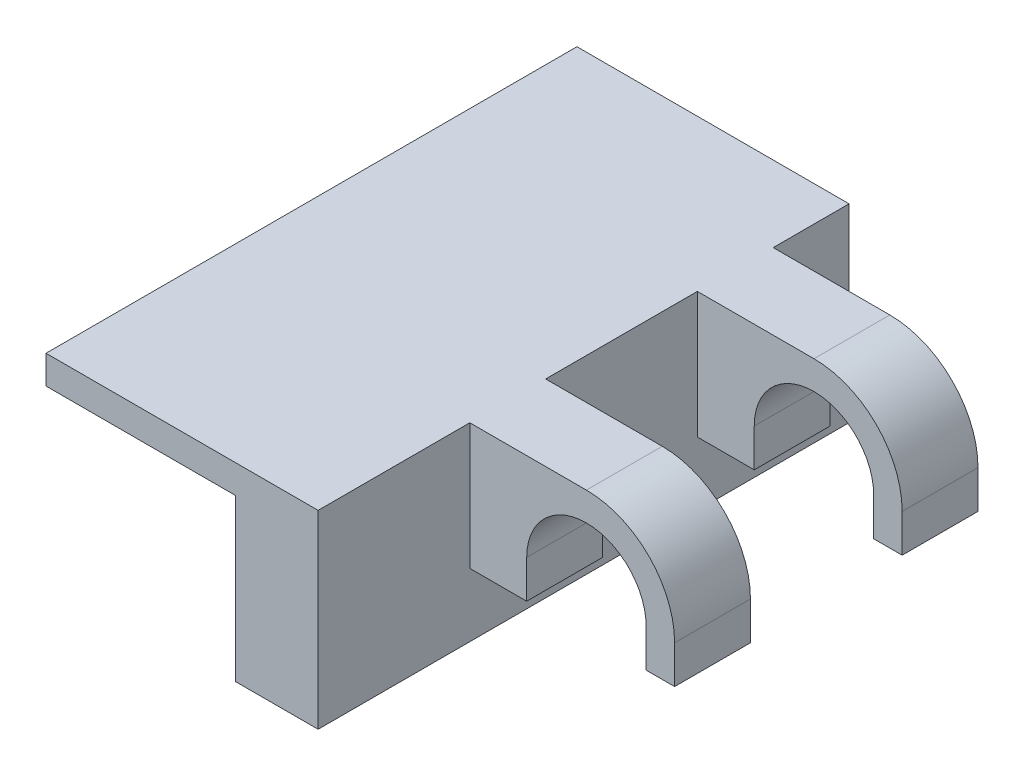
ISO-10303-21;
HEADER;
FILE_DESCRIPTION(('STEP AP214'),'2;1');
FILE_NAME('part.step','',(''),(''),'','','');
FILE_SCHEMA(('AUTOMOTIVE_DESIGN { 1 0 10303 214 1 1 1 1 }'));
ENDSEC;
DATA;
#1=APPLICATION_CONTEXT('core data for automotive mechanical design processes');
#2=APPLICATION_PROTOCOL_DEFINITION('international standard','automotive_design',2000,#1);
#3=PRODUCT_CONTEXT('',#1,'mechanical');
#4=PRODUCT('Part','Part','',(#3));
#5=PRODUCT_RELATED_PRODUCT_CATEGORY('part','',(#4));
#6=PRODUCT_DEFINITION_FORMATION('','',#4);
#7=PRODUCT_DEFINITION_CONTEXT('part definition',#1,'design');
#8=PRODUCT_DEFINITION('design','',#6,#7);
#9=PRODUCT_DEFINITION_SHAPE('','',#8);
#10=(LENGTH_UNIT() NAMED_UNIT(*) SI_UNIT(.MILLI.,.METRE.));
#11=(NAMED_UNIT(*) PLANE_ANGLE_UNIT() SI_UNIT($,.RADIAN.));
#12=(NAMED_UNIT(*) SI_UNIT($,.STERADIAN.) SOLID_ANGLE_UNIT());
#13=UNCERTAINTY_MEASURE_WITH_UNIT(LENGTH_MEASURE(1.E-05),#10,'distance_accuracy_value','');
#14=(GEOMETRIC_REPRESENTATION_CONTEXT(3) GLOBAL_UNCERTAINTY_ASSIGNED_CONTEXT((#13)) GLOBAL_UNIT_ASSIGNED_CONTEXT((#10,
#11,#12)) REPRESENTATION_CONTEXT('',''));
#15=CARTESIAN_POINT('',(0.,0.,0.));
#16=DIRECTION('',(0.,0.,1.));
#17=DIRECTION('',(1.,0.,0.));
#18=AXIS2_PLACEMENT_3D('',#15,#16,#17);
#19=CARTESIAN_POINT('',(191.85,-2.,14.));
#20=DIRECTION('',(0.,1.,0.));
#21=DIRECTION('',(-1.,0.,0.));
#22=AXIS2_PLACEMENT_3D('',#19,#20,#21);
#23=PLANE('',#22);
#24=DIRECTION('',(0.,0.,-1.));
#25=VECTOR('',#24,1.);
#26=CARTESIAN_POINT('',(191.85,-2.,14.));
#27=LINE('',#26,#25);
#28=CARTESIAN_POINT('',(191.85,-2.,6.));
#29=VERTEX_POINT('',#28);
#30=CARTESIAN_POINT('',(191.85,-2.,2.));
#31=VERTEX_POINT('',#30);
#32=EDGE_CURVE('E259',#29,#31,#27,.T.);
#33=ORIENTED_EDGE('',*,*,#32,.F.);
#34=DIRECTION('',(-1.,0.,0.));
#35=VECTOR('',#34,1.);
#36=CARTESIAN_POINT('',(191.85,-2.,6.));
#37=LINE('',#36,#35);
#38=CARTESIAN_POINT('',(188.85,-1.99999999999997,6.));
#39=VERTEX_POINT('',#38);
#40=EDGE_CURVE('E219',#29,#39,#37,.T.);
#41=ORIENTED_EDGE('',*,*,#40,.T.);
#42=DIRECTION('',(0.,0.,-1.));
#43=VECTOR('',#42,1.);
#44=CARTESIAN_POINT('',(188.85,-1.99999999999995,14.));
#45=LINE('',#44,#43);
#46=CARTESIAN_POINT('',(188.85,-1.99999999999997,2.));
#47=VERTEX_POINT('',#46);
#48=EDGE_CURVE('E262',#39,#47,#45,.T.);
#49=ORIENTED_EDGE('',*,*,#48,.T.);
#50=DIRECTION('',(1.,0.,0.));
#51=VECTOR('',#50,1.);
#52=CARTESIAN_POINT('',(191.85,-2.,2.));
#53=LINE('',#52,#51);
#54=EDGE_CURVE('E270',#47,#31,#53,.T.);
#55=ORIENTED_EDGE('',*,*,#54,.T.);
#56=EDGE_LOOP('',(#33,#41,#49,#55));
#57=FACE_BOUND('',#56,.T.);
#58=ADVANCED_FACE('F35',(#57),#23,.F.);
#59=CARTESIAN_POINT('',(191.85,0.,14.));
#60=DIRECTION('',(-1.,0.,0.));
#61=DIRECTION('',(0.,0.,1.));
#62=AXIS2_PLACEMENT_3D('',#59,#60,#61);
#63=PLANE('',#62);
#64=DIRECTION('',(0.,0.,-1.));
#65=VECTOR('',#64,1.);
#66=CARTESIAN_POINT('',(191.85,0.,14.));
#67=LINE('',#66,#65);
#68=CARTESIAN_POINT('',(191.85,0.,6.));
#69=VERTEX_POINT('',#68);
#70=CARTESIAN_POINT('',(191.85,0.,2.));
#71=VERTEX_POINT('',#70);
#72=EDGE_CURVE('E255',#69,#71,#67,.T.);
#73=ORIENTED_EDGE('',*,*,#72,.F.);
#74=DIRECTION('',(0.,-1.,0.));
#75=VECTOR('',#74,1.);
#76=CARTESIAN_POINT('',(191.85,0.,6.));
#77=LINE('',#76,#75);
#78=EDGE_CURVE('E224',#69,#29,#77,.T.);
#79=ORIENTED_EDGE('',*,*,#78,.T.);
#80=ORIENTED_EDGE('',*,*,#32,.T.);
#81=DIRECTION('',(0.,1.,0.));
#82=VECTOR('',#81,1.);
#83=CARTESIAN_POINT('',(191.85,0.,2.));
#84=LINE('',#83,#82);
#85=EDGE_CURVE('E346',#31,#71,#84,.T.);
#86=ORIENTED_EDGE('',*,*,#85,.T.);
#87=EDGE_LOOP('',(#73,#79,#80,#86));
#88=FACE_BOUND('',#87,.T.);
#89=ADVANCED_FACE('F443',(#88),#63,.F.);
#90=CARTESIAN_POINT('',(195.,0.,14.));
#91=DIRECTION('',(0.,0.,-1.));
#92=DIRECTION('',(-1.,0.,0.));
#93=AXIS2_PLACEMENT_3D('',#90,#91,#92);
#94=CYLINDRICAL_SURFACE('',#93,3.14999999999996);
#95=DIRECTION('',(0.,0.,-1.));
#96=VECTOR('',#95,1.);
#97=CARTESIAN_POINT('',(198.15,0.,14.));
#98=LINE('',#97,#96);
#99=CARTESIAN_POINT('',(198.15,0.,6.));
#100=VERTEX_POINT('',#99);
#101=CARTESIAN_POINT('',(198.15,0.,2.));
#102=VERTEX_POINT('',#101);
#103=EDGE_CURVE('E251',#100,#102,#98,.T.);
#104=ORIENTED_EDGE('',*,*,#103,.F.);
#105=CARTESIAN_POINT('',(195.,0.,6.));
#106=DIRECTION('',(0.,0.,-1.));
#107=DIRECTION('',(-1.,0.,0.));
#108=AXIS2_PLACEMENT_3D('',#105,#106,#107);
#109=CIRCLE('',#108,3.14999999999996);
#110=EDGE_CURVE('E359',#100,#69,#109,.F.);
#111=ORIENTED_EDGE('',*,*,#110,.T.);
#112=ORIENTED_EDGE('',*,*,#72,.T.);
#113=CARTESIAN_POINT('',(195.,0.,2.));
#114=DIRECTION('',(0.,0.,1.));
#115=DIRECTION('',(1.,0.,0.));
#116=AXIS2_PLACEMENT_3D('',#113,#114,#115);
#117=CIRCLE('',#116,3.14999999999996);
#118=EDGE_CURVE('E343',#71,#102,#117,.F.);
#119=ORIENTED_EDGE('',*,*,#118,.T.);
#120=EDGE_LOOP('',(#104,#111,#112,#119));
#121=FACE_BOUND('',#120,.T.);
#122=ADVANCED_FACE('F448',(#121),#94,.F.);
#123=CARTESIAN_POINT('',(198.15,0.,14.));
#124=DIRECTION('',(1.,0.,0.));
#125=DIRECTION('',(0.,1.,0.));
#126=AXIS2_PLACEMENT_3D('',#123,#124,#125);
#127=PLANE('',#126);
#128=DIRECTION('',(0.,0.,-1.));
#129=VECTOR('',#128,1.);
#130=CARTESIAN_POINT('',(198.15,-2.,14.));
#131=LINE('',#130,#129);
#132=CARTESIAN_POINT('',(198.15,-2.,6.));
#133=VERTEX_POINT('',#132);
#134=CARTESIAN_POINT('',(198.15,-2.,2.));
#135=VERTEX_POINT('',#134);
#136=EDGE_CURVE('E247',#133,#135,#131,.T.);
#137=ORIENTED_EDGE('',*,*,#136,.F.);
#138=DIRECTION('',(0.,1.,0.));
#139=VECTOR('',#138,1.);
#140=CARTESIAN_POINT('',(198.15,0.,6.));
#141=LINE('',#140,#139);
#142=EDGE_CURVE('E356',#133,#100,#141,.T.);
#143=ORIENTED_EDGE('',*,*,#142,.T.);
#144=ORIENTED_EDGE('',*,*,#103,.T.);
#145=DIRECTION('',(0.,-1.,0.));
#146=VECTOR('',#145,1.);
#147=CARTESIAN_POINT('',(198.15,0.,2.));
#148=LINE('',#147,#146);
#149=EDGE_CURVE('E340',#102,#135,#148,.T.);
#150=ORIENTED_EDGE('',*,*,#149,.T.);
#151=EDGE_LOOP('',(#137,#143,#144,#150));
#152=FACE_BOUND('',#151,.T.);
#153=ADVANCED_FACE('F486',(#152),#127,.F.);
#154=CARTESIAN_POINT('',(198.15,-2.,14.));
#155=DIRECTION('',(0.,1.,0.));
#156=DIRECTION('',(-1.,0.,0.));
#157=AXIS2_PLACEMENT_3D('',#154,#155,#156);
#158=PLANE('',#157);
#159=DIRECTION('',(0.,0.,-1.));
#160=VECTOR('',#159,1.);
#161=CARTESIAN_POINT('',(199.65,-2.,14.));
#162=LINE('',#161,#160);
#163=CARTESIAN_POINT('',(199.65,-2.,6.));
#164=VERTEX_POINT('',#163);
#165=CARTESIAN_POINT('',(199.65,-2.,2.));
#166=VERTEX_POINT('',#165);
#167=EDGE_CURVE('E243',#164,#166,#162,.T.);
#168=ORIENTED_EDGE('',*,*,#167,.F.);
#169=DIRECTION('',(-1.,0.,0.));
#170=VECTOR('',#169,1.);
#171=CARTESIAN_POINT('',(198.15,-2.,6.));
#172=LINE('',#171,#170);
#173=EDGE_CURVE('E353',#164,#133,#172,.T.);
#174=ORIENTED_EDGE('',*,*,#173,.T.);
#175=ORIENTED_EDGE('',*,*,#136,.T.);
#176=DIRECTION('',(1.,0.,0.));
#177=VECTOR('',#176,1.);
#178=CARTESIAN_POINT('',(198.15,-2.,2.));
#179=LINE('',#178,#177);
#180=EDGE_CURVE('E337',#135,#166,#179,.T.);
#181=ORIENTED_EDGE('',*,*,#180,.T.);
#182=EDGE_LOOP('',(#168,#174,#175,#181));
#183=FACE_BOUND('',#182,.T.);
#184=ADVANCED_FACE('F469',(#183),#158,.F.);
#185=CARTESIAN_POINT('',(199.65,-2.,14.));
#186=DIRECTION('',(-1.,0.,0.));
#187=DIRECTION('',(0.,-1.,0.));
#188=AXIS2_PLACEMENT_3D('',#185,#186,#187);
#189=PLANE('',#188);
#190=DIRECTION('',(0.,0.,-1.));
#191=VECTOR('',#190,1.);
#192=CARTESIAN_POINT('',(199.65,0.,14.));
#193=LINE('',#192,#191);
#194=CARTESIAN_POINT('',(199.65,0.,6.));
#195=VERTEX_POINT('',#194);
#196=CARTESIAN_POINT('',(199.65,0.,2.));
#197=VERTEX_POINT('',#196);
#198=EDGE_CURVE('E239',#195,#197,#193,.T.);
#199=ORIENTED_EDGE('',*,*,#198,.F.);
#200=DIRECTION('',(0.,-1.,0.));
#201=VECTOR('',#200,1.);
#202=CARTESIAN_POINT('',(199.65,4.65000000000001,6.));
#203=LINE('',#202,#201);
#204=EDGE_CURVE('E303',#195,#164,#203,.T.);
#205=ORIENTED_EDGE('',*,*,#204,.T.);
#206=ORIENTED_EDGE('',*,*,#167,.T.);
#207=DIRECTION('',(0.,-1.,0.));
#208=VECTOR('',#207,1.);
#209=CARTESIAN_POINT('',(199.65,4.65000000000001,2.));
#210=LINE('',#209,#208);
#211=EDGE_CURVE('E284',#197,#166,#210,.T.);
#212=ORIENTED_EDGE('',*,*,#211,.F.);
#213=EDGE_LOOP('',(#199,#205,#206,#212));
#214=FACE_BOUND('',#213,.T.);
#215=ADVANCED_FACE('F463',(#214),#189,.F.);
#216=CARTESIAN_POINT('',(195.,0.,14.));
#217=DIRECTION('',(0.,0.,-1.));
#218=DIRECTION('',(-1.,0.,0.));
#219=AXIS2_PLACEMENT_3D('',#216,#217,#218);
#220=CYLINDRICAL_SURFACE('',#219,4.64999999999994);
#221=DIRECTION('',(0.,0.,-1.));
#222=VECTOR('',#221,1.);
#223=CARTESIAN_POINT('',(195.,4.64999999999999,14.));
#224=LINE('',#223,#222);
#225=CARTESIAN_POINT('',(195.,4.65000000000001,6.));
#226=VERTEX_POINT('',#225);
#227=CARTESIAN_POINT('',(195.,4.65000000000001,2.));
#228=VERTEX_POINT('',#227);
#229=EDGE_CURVE('E235',#226,#228,#224,.T.);
#230=ORIENTED_EDGE('',*,*,#229,.F.);
#231=CARTESIAN_POINT('',(195.,0.,6.));
#232=DIRECTION('',(0.,0.,-1.));
#233=DIRECTION('',(-1.,0.,0.));
#234=AXIS2_PLACEMENT_3D('',#231,#232,#233);
#235=CIRCLE('',#234,4.64999999999994);
#236=EDGE_CURVE('E350',#226,#195,#235,.T.);
#237=ORIENTED_EDGE('',*,*,#236,.T.);
#238=ORIENTED_EDGE('',*,*,#198,.T.);
#239=CARTESIAN_POINT('',(195.,0.,2.));
#240=DIRECTION('',(0.,0.,1.));
#241=DIRECTION('',(1.,0.,0.));
#242=AXIS2_PLACEMENT_3D('',#239,#240,#241);
#243=CIRCLE('',#242,4.64999999999994);
#244=EDGE_CURVE('E334',#197,#228,#243,.T.);
#245=ORIENTED_EDGE('',*,*,#244,.T.);
#246=EDGE_LOOP('',(#230,#237,#238,#245));
#247=FACE_BOUND('',#246,.T.);
#248=ADVANCED_FACE('F459',(#247),#220,.T.);
#249=CARTESIAN_POINT('',(-188.85,-5.35000000000001,14.));
#250=DIRECTION('',(0.,1.,0.));
#251=DIRECTION('',(-1.,0.,0.));
#252=AXIS2_PLACEMENT_3D('',#249,#250,#251);
#253=PLANE('',#252);
#254=DIRECTION('',(1.,0.,0.));
#255=VECTOR('',#254,1.);
#256=CARTESIAN_POINT('',(-188.85,-5.35000000000001,14.));
#257=LINE('',#256,#255);
#258=CARTESIAN_POINT('',(184.5,-5.35000000000001,14.));
#259=VERTEX_POINT('',#258);
#260=CARTESIAN_POINT('',(188.85,-5.34999999999997,14.));
#261=VERTEX_POINT('',#260);
#262=EDGE_CURVE('E212',#259,#261,#257,.T.);
#263=ORIENTED_EDGE('',*,*,#262,.F.);
#264=DIRECTION('',(0.,0.,1.));
#265=VECTOR('',#264,1.);
#266=CARTESIAN_POINT('',(184.5,-5.35000000000001,-14.));
#267=LINE('',#266,#265);
#268=CARTESIAN_POINT('',(184.5,-5.35000000000001,-14.));
#269=VERTEX_POINT('',#268);
#270=EDGE_CURVE('E200',#269,#259,#267,.T.);
#271=ORIENTED_EDGE('',*,*,#270,.F.);
#272=DIRECTION('',(1.,0.,0.));
#273=VECTOR('',#272,1.);
#274=CARTESIAN_POINT('',(-188.85,-5.35000000000001,-14.));
#275=LINE('',#274,#273);
#276=CARTESIAN_POINT('',(188.85,-5.34999999999997,-14.));
#277=VERTEX_POINT('',#276);
#278=EDGE_CURVE('E210',#269,#277,#275,.T.);
#279=ORIENTED_EDGE('',*,*,#278,.T.);
#280=DIRECTION('',(0.,0.,-1.));
#281=VECTOR('',#280,1.);
#282=CARTESIAN_POINT('',(188.85,-5.34999999999997,14.));
#283=LINE('',#282,#281);
#284=EDGE_CURVE('E43',#261,#277,#283,.T.);
#285=ORIENTED_EDGE('',*,*,#284,.F.);
#286=EDGE_LOOP('',(#263,#271,#279,#285));
#287=FACE_BOUND('',#286,.T.);
#288=ADVANCED_FACE('F37',(#287),#253,.F.);
#289=CARTESIAN_POINT('',(188.85,-1.99999999999995,14.));
#290=DIRECTION('',(-1.,0.,0.));
#291=DIRECTION('',(0.,0.,1.));
#292=AXIS2_PLACEMENT_3D('',#289,#290,#291);
#293=PLANE('',#292);
#294=CARTESIAN_POINT('',(188.85,-1.99999999999997,-6.));
#295=VERTEX_POINT('',#294);
#296=CARTESIAN_POINT('',(188.85,-1.99999999999997,-10.));
#297=VERTEX_POINT('',#296);
#298=EDGE_CURVE('E260',#295,#297,#45,.T.);
#299=ORIENTED_EDGE('',*,*,#298,.F.);
#300=DIRECTION('',(0.,-1.,0.));
#301=VECTOR('',#300,1.);
#302=CARTESIAN_POINT('',(188.85,4.65000000000001,-6.));
#303=LINE('',#302,#301);
#304=CARTESIAN_POINT('',(188.85,4.65000000000001,-6.));
#305=VERTEX_POINT('',#304);
#306=EDGE_CURVE('E297',#305,#295,#303,.T.);
#307=ORIENTED_EDGE('',*,*,#306,.F.);
#308=DIRECTION('',(0.,0.,-1.));
#309=VECTOR('',#308,1.);
#310=CARTESIAN_POINT('',(188.85,4.65000000000001,2.));
#311=LINE('',#310,#309);
#312=CARTESIAN_POINT('',(188.85,4.65000000000001,2.));
#313=VERTEX_POINT('',#312);
#314=EDGE_CURVE('E281',#313,#305,#311,.T.);
#315=ORIENTED_EDGE('',*,*,#314,.F.);
#316=DIRECTION('',(0.,-1.,0.));
#317=VECTOR('',#316,1.);
#318=CARTESIAN_POINT('',(188.85,4.65000000000001,2.));
#319=LINE('',#318,#317);
#320=EDGE_CURVE('E279',#313,#47,#319,.T.);
#321=ORIENTED_EDGE('',*,*,#320,.T.);
#322=ORIENTED_EDGE('',*,*,#48,.F.);
#323=DIRECTION('',(0.,-1.,0.));
#324=VECTOR('',#323,1.);
#325=CARTESIAN_POINT('',(188.85,4.65000000000001,6.));
#326=LINE('',#325,#324);
#327=CARTESIAN_POINT('',(188.85,4.65000000000001,6.));
#328=VERTEX_POINT('',#327);
#329=EDGE_CURVE('E276',#328,#39,#326,.T.);
#330=ORIENTED_EDGE('',*,*,#329,.F.);
#331=DIRECTION('',(0.,0.,-1.));
#332=VECTOR('',#331,1.);
#333=CARTESIAN_POINT('',(188.85,4.65000000000001,14.));
#334=LINE('',#333,#332);
#335=CARTESIAN_POINT('',(188.85,4.64999999999999,14.));
#336=VERTEX_POINT('',#335);
#337=EDGE_CURVE('E283',#336,#328,#334,.T.);
#338=ORIENTED_EDGE('',*,*,#337,.F.);
#339=DIRECTION('',(0.,1.,0.));
#340=VECTOR('',#339,1.);
#341=CARTESIAN_POINT('',(188.85,-1.99999999999995,14.));
#342=LINE('',#341,#340);
#343=EDGE_CURVE('E364',#261,#336,#342,.T.);
#344=ORIENTED_EDGE('',*,*,#343,.F.);
#345=ORIENTED_EDGE('',*,*,#284,.T.);
#346=DIRECTION('',(0.,1.,0.));
#347=VECTOR('',#346,1.);
#348=CARTESIAN_POINT('',(188.85,-1.99999999999995,-14.));
#349=LINE('',#348,#347);
#350=CARTESIAN_POINT('',(188.85,4.65000000000001,-14.));
#351=VERTEX_POINT('',#350);
#352=EDGE_CURVE('E218',#277,#351,#349,.T.);
#353=ORIENTED_EDGE('',*,*,#352,.T.);
#354=DIRECTION('',(0.,0.,-1.));
#355=VECTOR('',#354,1.);
#356=CARTESIAN_POINT('',(188.85,4.65000000000001,-10.));
#357=LINE('',#356,#355);
#358=CARTESIAN_POINT('',(188.85,4.65000000000001,-10.));
#359=VERTEX_POINT('',#358);
#360=EDGE_CURVE('E380',#359,#351,#357,.T.);
#361=ORIENTED_EDGE('',*,*,#360,.F.);
#362=DIRECTION('',(0.,-1.,0.));
#363=VECTOR('',#362,1.);
#364=CARTESIAN_POINT('',(188.85,4.65000000000001,-10.));
#365=LINE('',#364,#363);
#366=EDGE_CURVE('E393',#359,#297,#365,.T.);
#367=ORIENTED_EDGE('',*,*,#366,.T.);
#368=EDGE_LOOP('',(#299,#307,#315,#321,#322,#330,#338,#344,#345,#353,#361,#367));
#369=FACE_BOUND('',#368,.T.);
#370=ADVANCED_FACE('F274',(#369),#293,.F.);
#371=CARTESIAN_POINT('',(191.85,-2.,-6.));
#372=VERTEX_POINT('',#371);
#373=CARTESIAN_POINT('',(191.85,-2.,-10.));
#374=VERTEX_POINT('',#373);
#375=EDGE_CURVE('E256',#372,#374,#27,.T.);
#376=ORIENTED_EDGE('',*,*,#375,.F.);
#377=DIRECTION('',(-1.,0.,0.));
#378=VECTOR('',#377,1.);
#379=CARTESIAN_POINT('',(191.85,-2.,-6.));
#380=LINE('',#379,#378);
#381=EDGE_CURVE('E331',#372,#295,#380,.T.);
#382=ORIENTED_EDGE('',*,*,#381,.T.);
#383=ORIENTED_EDGE('',*,*,#298,.T.);
#384=DIRECTION('',(1.,0.,0.));
#385=VECTOR('',#384,1.);
#386=CARTESIAN_POINT('',(191.85,-2.,-10.));
#387=LINE('',#386,#385);
#388=EDGE_CURVE('E315',#297,#374,#387,.T.);
#389=ORIENTED_EDGE('',*,*,#388,.T.);
#390=EDGE_LOOP('',(#376,#382,#383,#389));
#391=FACE_BOUND('',#390,.T.);
#392=ADVANCED_FACE('F423',(#391),#23,.F.);
#393=CARTESIAN_POINT('',(191.85,0.,-6.));
#394=VERTEX_POINT('',#393);
#395=CARTESIAN_POINT('',(191.85,0.,-10.));
#396=VERTEX_POINT('',#395);
#397=EDGE_CURVE('E252',#394,#396,#67,.T.);
#398=ORIENTED_EDGE('',*,*,#397,.F.);
#399=DIRECTION('',(0.,-1.,0.));
#400=VECTOR('',#399,1.);
#401=CARTESIAN_POINT('',(191.85,0.,-6.));
#402=LINE('',#401,#400);
#403=EDGE_CURVE('E328',#394,#372,#402,.T.);
#404=ORIENTED_EDGE('',*,*,#403,.T.);
#405=ORIENTED_EDGE('',*,*,#375,.T.);
#406=DIRECTION('',(0.,1.,0.));
#407=VECTOR('',#406,1.);
#408=CARTESIAN_POINT('',(191.85,0.,-10.));
#409=LINE('',#408,#407);
#410=EDGE_CURVE('E312',#374,#396,#409,.T.);
#411=ORIENTED_EDGE('',*,*,#410,.T.);
#412=EDGE_LOOP('',(#398,#404,#405,#411));
#413=FACE_BOUND('',#412,.T.);
#414=ADVANCED_FACE('F420',(#413),#63,.F.);
#415=CARTESIAN_POINT('',(198.15,0.,-6.));
#416=VERTEX_POINT('',#415);
#417=CARTESIAN_POINT('',(198.15,0.,-10.));
#418=VERTEX_POINT('',#417);
#419=EDGE_CURVE('E248',#416,#418,#98,.T.);
#420=ORIENTED_EDGE('',*,*,#419,.F.);
#421=CARTESIAN_POINT('',(195.,0.,-6.));
#422=DIRECTION('',(0.,0.,-1.));
#423=DIRECTION('',(-1.,0.,0.));
#424=AXIS2_PLACEMENT_3D('',#421,#422,#423);
#425=CIRCLE('',#424,3.14999999999996);
#426=EDGE_CURVE('E325',#416,#394,#425,.F.);
#427=ORIENTED_EDGE('',*,*,#426,.T.);
#428=ORIENTED_EDGE('',*,*,#397,.T.);
#429=CARTESIAN_POINT('',(195.,0.,-10.));
#430=DIRECTION('',(0.,0.,1.));
#431=DIRECTION('',(1.,0.,0.));
#432=AXIS2_PLACEMENT_3D('',#429,#430,#431);
#433=CIRCLE('',#432,3.14999999999996);
#434=EDGE_CURVE('E309',#396,#418,#433,.F.);
#435=ORIENTED_EDGE('',*,*,#434,.T.);
#436=EDGE_LOOP('',(#420,#427,#428,#435));
#437=FACE_BOUND('',#436,.T.);
#438=ADVANCED_FACE('F417',(#437),#94,.F.);
#439=CARTESIAN_POINT('',(198.15,-2.,-6.));
#440=VERTEX_POINT('',#439);
#441=CARTESIAN_POINT('',(198.15,-2.,-10.));
#442=VERTEX_POINT('',#441);
#443=EDGE_CURVE('E244',#440,#442,#131,.T.);
#444=ORIENTED_EDGE('',*,*,#443,.F.);
#445=DIRECTION('',(0.,1.,0.));
#446=VECTOR('',#445,1.);
#447=CARTESIAN_POINT('',(198.15,0.,-6.));
#448=LINE('',#447,#446);
#449=EDGE_CURVE('E322',#440,#416,#448,.T.);
#450=ORIENTED_EDGE('',*,*,#449,.T.);
#451=ORIENTED_EDGE('',*,*,#419,.T.);
#452=DIRECTION('',(0.,-1.,0.));
#453=VECTOR('',#452,1.);
#454=CARTESIAN_POINT('',(198.15,0.,-10.));
#455=LINE('',#454,#453);
#456=EDGE_CURVE('E306',#418,#442,#455,.T.);
#457=ORIENTED_EDGE('',*,*,#456,.T.);
#458=EDGE_LOOP('',(#444,#450,#451,#457));
#459=FACE_BOUND('',#458,.T.);
#460=ADVANCED_FACE('F414',(#459),#127,.F.);
#461=CARTESIAN_POINT('',(199.65,-2.,-6.));
#462=VERTEX_POINT('',#461);
#463=CARTESIAN_POINT('',(199.65,-2.,-10.));
#464=VERTEX_POINT('',#463);
#465=EDGE_CURVE('E240',#462,#464,#162,.T.);
#466=ORIENTED_EDGE('',*,*,#465,.F.);
#467=DIRECTION('',(-1.,0.,0.));
#468=VECTOR('',#467,1.);
#469=CARTESIAN_POINT('',(198.15,-2.,-6.));
#470=LINE('',#469,#468);
#471=EDGE_CURVE('E319',#462,#440,#470,.T.);
#472=ORIENTED_EDGE('',*,*,#471,.T.);
#473=ORIENTED_EDGE('',*,*,#443,.T.);
#474=DIRECTION('',(1.,0.,0.));
#475=VECTOR('',#474,1.);
#476=CARTESIAN_POINT('',(198.15,-2.,-10.));
#477=LINE('',#476,#475);
#478=EDGE_CURVE('E302',#442,#464,#477,.T.);
#479=ORIENTED_EDGE('',*,*,#478,.T.);
#480=EDGE_LOOP('',(#466,#472,#473,#479));
#481=FACE_BOUND('',#480,.T.);
#482=ADVANCED_FACE('F411',(#481),#158,.F.);
#483=CARTESIAN_POINT('',(199.65,0.,-6.));
#484=VERTEX_POINT('',#483);
#485=CARTESIAN_POINT('',(199.65,0.,-10.));
#486=VERTEX_POINT('',#485);
#487=EDGE_CURVE('E236',#484,#486,#193,.T.);
#488=ORIENTED_EDGE('',*,*,#487,.F.);
#489=DIRECTION('',(0.,-1.,0.));
#490=VECTOR('',#489,1.);
#491=CARTESIAN_POINT('',(199.65,4.65000000000001,-6.));
#492=LINE('',#491,#490);
#493=EDGE_CURVE('E289',#484,#462,#492,.T.);
#494=ORIENTED_EDGE('',*,*,#493,.T.);
#495=ORIENTED_EDGE('',*,*,#465,.T.);
#496=DIRECTION('',(0.,-1.,0.));
#497=VECTOR('',#496,1.);
#498=CARTESIAN_POINT('',(199.65,4.65000000000001,-10.));
#499=LINE('',#498,#497);
#500=EDGE_CURVE('E392',#486,#464,#499,.T.);
#501=ORIENTED_EDGE('',*,*,#500,.F.);
#502=EDGE_LOOP('',(#488,#494,#495,#501));
#503=FACE_BOUND('',#502,.T.);
#504=ADVANCED_FACE('F408',(#503),#189,.F.);
#505=CARTESIAN_POINT('',(195.,4.64999999999999,-6.));
#506=VERTEX_POINT('',#505);
#507=CARTESIAN_POINT('',(195.,4.65000000000001,-10.));
#508=VERTEX_POINT('',#507);
#509=EDGE_CURVE('E232',#506,#508,#224,.T.);
#510=ORIENTED_EDGE('',*,*,#509,.F.);
#511=CARTESIAN_POINT('',(195.,0.,-6.));
#512=DIRECTION('',(0.,0.,-1.));
#513=DIRECTION('',(-1.,0.,0.));
#514=AXIS2_PLACEMENT_3D('',#511,#512,#513);
#515=CIRCLE('',#514,4.64999999999994);
#516=EDGE_CURVE('E58',#506,#484,#515,.T.);
#517=ORIENTED_EDGE('',*,*,#516,.T.);
#518=ORIENTED_EDGE('',*,*,#487,.T.);
#519=CARTESIAN_POINT('',(195.,0.,-10.));
#520=DIRECTION('',(0.,0.,1.));
#521=DIRECTION('',(1.,0.,0.));
#522=AXIS2_PLACEMENT_3D('',#519,#520,#521);
#523=CIRCLE('',#522,4.64999999999994);
#524=EDGE_CURVE('E299',#486,#508,#523,.T.);
#525=ORIENTED_EDGE('',*,*,#524,.T.);
#526=EDGE_LOOP('',(#510,#517,#518,#525));
#527=FACE_BOUND('',#526,.T.);
#528=ADVANCED_FACE('F402',(#527),#220,.T.);
#529=CARTESIAN_POINT('',(-195.,4.64999999999999,14.));
#530=DIRECTION('',(0.,-1.,0.));
#531=DIRECTION('',(0.,0.,-1.));
#532=AXIS2_PLACEMENT_3D('',#529,#530,#531);
#533=PLANE('',#532);
#534=DIRECTION('',(-1.,0.,0.));
#535=VECTOR('',#534,1.);
#536=CARTESIAN_POINT('',(-195.,4.64999999999999,-14.));
#537=LINE('',#536,#535);
#538=CARTESIAN_POINT('',(174.5,4.64999999999999,-14.));
#539=VERTEX_POINT('',#538);
#540=EDGE_CURVE('E221',#351,#539,#537,.T.);
#541=ORIENTED_EDGE('',*,*,#540,.T.);
#542=DIRECTION('',(0.,0.,1.));
#543=VECTOR('',#542,1.);
#544=CARTESIAN_POINT('',(174.5,4.64999999999999,-14.));
#545=LINE('',#544,#543);
#546=CARTESIAN_POINT('',(174.5,4.64999999999999,14.));
#547=VERTEX_POINT('',#546);
#548=EDGE_CURVE('E375',#539,#547,#545,.T.);
#549=ORIENTED_EDGE('',*,*,#548,.T.);
#550=DIRECTION('',(-1.,0.,0.));
#551=VECTOR('',#550,1.);
#552=CARTESIAN_POINT('',(-195.,4.64999999999999,14.));
#553=LINE('',#552,#551);
#554=EDGE_CURVE('E227',#336,#547,#553,.T.);
#555=ORIENTED_EDGE('',*,*,#554,.F.);
#556=ORIENTED_EDGE('',*,*,#337,.T.);
#557=DIRECTION('',(1.,0.,0.));
#558=VECTOR('',#557,1.);
#559=CARTESIAN_POINT('',(188.85,4.65000000000001,6.));
#560=LINE('',#559,#558);
#561=EDGE_CURVE('E287',#328,#226,#560,.T.);
#562=ORIENTED_EDGE('',*,*,#561,.T.);
#563=ORIENTED_EDGE('',*,*,#229,.T.);
#564=DIRECTION('',(-1.,0.,0.));
#565=VECTOR('',#564,1.);
#566=CARTESIAN_POINT('',(-195.,4.64999999999999,2.));
#567=LINE('',#566,#565);
#568=EDGE_CURVE('E11',#228,#313,#567,.T.);
#569=ORIENTED_EDGE('',*,*,#568,.T.);
#570=ORIENTED_EDGE('',*,*,#314,.T.);
#571=DIRECTION('',(1.,0.,0.));
#572=VECTOR('',#571,1.);
#573=CARTESIAN_POINT('',(188.85,4.65000000000001,-6.));
#574=LINE('',#573,#572);
#575=EDGE_CURVE('E292',#305,#506,#574,.T.);
#576=ORIENTED_EDGE('',*,*,#575,.T.);
#577=ORIENTED_EDGE('',*,*,#509,.T.);
#578=DIRECTION('',(-1.,0.,0.));
#579=VECTOR('',#578,1.);
#580=CARTESIAN_POINT('',(188.85,4.65000000000001,-10.));
#581=LINE('',#580,#579);
#582=EDGE_CURVE('E383',#508,#359,#581,.T.);
#583=ORIENTED_EDGE('',*,*,#582,.T.);
#584=ORIENTED_EDGE('',*,*,#360,.T.);
#585=EDGE_LOOP('',(#541,#549,#555,#556,#562,#563,#569,#570,#576,#577,#583,#584));
#586=FACE_BOUND('',#585,.T.);
#587=ADVANCED_FACE('F373',(#586),#533,.F.);
#588=CARTESIAN_POINT('',(195.,0.,14.));
#589=DIRECTION('',(0.,0.,1.));
#590=DIRECTION('',(1.,0.,0.));
#591=AXIS2_PLACEMENT_3D('',#588,#589,#590);
#592=PLANE('',#591);
#593=DIRECTION('',(0.,1.,0.));
#594=VECTOR('',#593,1.);
#595=CARTESIAN_POINT('',(174.5,4.64999999999999,14.));
#596=LINE('',#595,#594);
#597=CARTESIAN_POINT('',(174.5,3.15000000000003,14.));
#598=VERTEX_POINT('',#597);
#599=EDGE_CURVE('E205',#598,#547,#596,.T.);
#600=ORIENTED_EDGE('',*,*,#599,.F.);
#601=DIRECTION('',(-1.,0.,0.));
#602=VECTOR('',#601,1.);
#603=CARTESIAN_POINT('',(174.5,3.15000000000003,14.));
#604=LINE('',#603,#602);
#605=CARTESIAN_POINT('',(184.5,3.15000000000003,14.));
#606=VERTEX_POINT('',#605);
#607=EDGE_CURVE('E429',#606,#598,#604,.T.);
#608=ORIENTED_EDGE('',*,*,#607,.F.);
#609=DIRECTION('',(0.,1.,0.));
#610=VECTOR('',#609,1.);
#611=CARTESIAN_POINT('',(184.5,3.15000000000003,14.));
#612=LINE('',#611,#610);
#613=EDGE_CURVE('E428',#259,#606,#612,.T.);
#614=ORIENTED_EDGE('',*,*,#613,.F.);
#615=ORIENTED_EDGE('',*,*,#262,.T.);
#616=ORIENTED_EDGE('',*,*,#343,.T.);
#617=ORIENTED_EDGE('',*,*,#554,.T.);
#618=EDGE_LOOP('',(#600,#608,#614,#615,#616,#617));
#619=FACE_BOUND('',#618,.T.);
#620=ADVANCED_FACE('F369',(#619),#592,.T.);
#621=CARTESIAN_POINT('',(195.,0.,-14.));
#622=DIRECTION('',(0.,0.,1.));
#623=DIRECTION('',(1.,0.,0.));
#624=AXIS2_PLACEMENT_3D('',#621,#622,#623);
#625=PLANE('',#624);
#626=DIRECTION('',(-1.,0.,0.));
#627=VECTOR('',#626,1.);
#628=CARTESIAN_POINT('',(174.5,3.15000000000003,-14.));
#629=LINE('',#628,#627);
#630=CARTESIAN_POINT('',(184.5,3.15000000000003,-14.));
#631=VERTEX_POINT('',#630);
#632=CARTESIAN_POINT('',(174.5,3.15000000000003,-14.));
#633=VERTEX_POINT('',#632);
#634=EDGE_CURVE('E50',#631,#633,#629,.T.);
#635=ORIENTED_EDGE('',*,*,#634,.T.);
#636=DIRECTION('',(0.,1.,0.));
#637=VECTOR('',#636,1.);
#638=CARTESIAN_POINT('',(174.5,4.64999999999999,-14.));
#639=LINE('',#638,#637);
#640=EDGE_CURVE('E213',#633,#539,#639,.T.);
#641=ORIENTED_EDGE('',*,*,#640,.T.);
#642=ORIENTED_EDGE('',*,*,#540,.F.);
#643=ORIENTED_EDGE('',*,*,#352,.F.);
#644=ORIENTED_EDGE('',*,*,#278,.F.);
#645=DIRECTION('',(0.,1.,0.));
#646=VECTOR('',#645,1.);
#647=CARTESIAN_POINT('',(184.5,3.15000000000003,-14.));
#648=LINE('',#647,#646);
#649=EDGE_CURVE('E196',#269,#631,#648,.T.);
#650=ORIENTED_EDGE('',*,*,#649,.T.);
#651=EDGE_LOOP('',(#635,#641,#642,#643,#644,#650));
#652=FACE_BOUND('',#651,.T.);
#653=ADVANCED_FACE('F216',(#652),#625,.F.);
#654=CARTESIAN_POINT('',(188.85,4.65000000000001,-10.));
#655=DIRECTION('',(0.,0.,1.));
#656=DIRECTION('',(1.,0.,0.));
#657=AXIS2_PLACEMENT_3D('',#654,#655,#656);
#658=PLANE('',#657);
#659=ORIENTED_EDGE('',*,*,#366,.F.);
#660=ORIENTED_EDGE('',*,*,#582,.F.);
#661=ORIENTED_EDGE('',*,*,#524,.F.);
#662=ORIENTED_EDGE('',*,*,#500,.T.);
#663=ORIENTED_EDGE('',*,*,#478,.F.);
#664=ORIENTED_EDGE('',*,*,#456,.F.);
#665=ORIENTED_EDGE('',*,*,#434,.F.);
#666=ORIENTED_EDGE('',*,*,#410,.F.);
#667=ORIENTED_EDGE('',*,*,#388,.F.);
#668=EDGE_LOOP('',(#659,#660,#661,#662,#663,#664,#665,#666,#667));
#669=FACE_BOUND('',#668,.T.);
#670=ADVANCED_FACE('F406',(#669),#658,.F.);
#671=CARTESIAN_POINT('',(188.85,4.65000000000001,6.));
#672=DIRECTION('',(0.,0.,-1.));
#673=DIRECTION('',(-1.,0.,0.));
#674=AXIS2_PLACEMENT_3D('',#671,#672,#673);
#675=PLANE('',#674);
#676=ORIENTED_EDGE('',*,*,#78,.F.);
#677=ORIENTED_EDGE('',*,*,#110,.F.);
#678=ORIENTED_EDGE('',*,*,#142,.F.);
#679=ORIENTED_EDGE('',*,*,#173,.F.);
#680=ORIENTED_EDGE('',*,*,#204,.F.);
#681=ORIENTED_EDGE('',*,*,#236,.F.);
#682=ORIENTED_EDGE('',*,*,#561,.F.);
#683=ORIENTED_EDGE('',*,*,#329,.T.);
#684=ORIENTED_EDGE('',*,*,#40,.F.);
#685=EDGE_LOOP('',(#676,#677,#678,#679,#680,#681,#682,#683,#684));
#686=FACE_BOUND('',#685,.T.);
#687=ADVANCED_FACE('F503',(#686),#675,.F.);
#688=CARTESIAN_POINT('',(188.85,4.65000000000001,2.));
#689=DIRECTION('',(0.,0.,1.));
#690=DIRECTION('',(1.,0.,0.));
#691=AXIS2_PLACEMENT_3D('',#688,#689,#690);
#692=PLANE('',#691);
#693=ORIENTED_EDGE('',*,*,#320,.F.);
#694=ORIENTED_EDGE('',*,*,#568,.F.);
#695=ORIENTED_EDGE('',*,*,#244,.F.);
#696=ORIENTED_EDGE('',*,*,#211,.T.);
#697=ORIENTED_EDGE('',*,*,#180,.F.);
#698=ORIENTED_EDGE('',*,*,#149,.F.);
#699=ORIENTED_EDGE('',*,*,#118,.F.);
#700=ORIENTED_EDGE('',*,*,#85,.F.);
#701=ORIENTED_EDGE('',*,*,#54,.F.);
#702=EDGE_LOOP('',(#693,#694,#695,#696,#697,#698,#699,#700,#701));
#703=FACE_BOUND('',#702,.T.);
#704=ADVANCED_FACE('F511',(#703),#692,.F.);
#705=CARTESIAN_POINT('',(188.85,4.65000000000001,-6.));
#706=DIRECTION('',(0.,0.,-1.));
#707=DIRECTION('',(-1.,0.,0.));
#708=AXIS2_PLACEMENT_3D('',#705,#706,#707);
#709=PLANE('',#708);
#710=ORIENTED_EDGE('',*,*,#403,.F.);
#711=ORIENTED_EDGE('',*,*,#426,.F.);
#712=ORIENTED_EDGE('',*,*,#449,.F.);
#713=ORIENTED_EDGE('',*,*,#471,.F.);
#714=ORIENTED_EDGE('',*,*,#493,.F.);
#715=ORIENTED_EDGE('',*,*,#516,.F.);
#716=ORIENTED_EDGE('',*,*,#575,.F.);
#717=ORIENTED_EDGE('',*,*,#306,.T.);
#718=ORIENTED_EDGE('',*,*,#381,.F.);
#719=EDGE_LOOP('',(#710,#711,#712,#713,#714,#715,#716,#717,#718));
#720=FACE_BOUND('',#719,.T.);
#721=ADVANCED_FACE('F440',(#720),#709,.F.);
#722=CARTESIAN_POINT('',(174.5,4.64999999999999,-14.));
#723=DIRECTION('',(1.,0.,0.));
#724=DIRECTION('',(0.,0.,-1.));
#725=AXIS2_PLACEMENT_3D('',#722,#723,#724);
#726=PLANE('',#725);
#727=ORIENTED_EDGE('',*,*,#599,.T.);
#728=ORIENTED_EDGE('',*,*,#548,.F.);
#729=ORIENTED_EDGE('',*,*,#640,.F.);
#730=DIRECTION('',(0.,0.,1.));
#731=VECTOR('',#730,1.);
#732=CARTESIAN_POINT('',(174.5,3.15000000000003,-14.));
#733=LINE('',#732,#731);
#734=EDGE_CURVE('E381',#633,#598,#733,.T.);
#735=ORIENTED_EDGE('',*,*,#734,.T.);
#736=EDGE_LOOP('',(#727,#728,#729,#735));
#737=FACE_BOUND('',#736,.T.);
#738=ADVANCED_FACE('F431',(#737),#726,.F.);
#739=CARTESIAN_POINT('',(174.5,3.15000000000003,-14.));
#740=DIRECTION('',(0.,1.,0.));
#741=DIRECTION('',(-1.,0.,0.));
#742=AXIS2_PLACEMENT_3D('',#739,#740,#741);
#743=PLANE('',#742);
#744=ORIENTED_EDGE('',*,*,#607,.T.);
#745=ORIENTED_EDGE('',*,*,#734,.F.);
#746=ORIENTED_EDGE('',*,*,#634,.F.);
#747=DIRECTION('',(0.,0.,1.));
#748=VECTOR('',#747,1.);
#749=CARTESIAN_POINT('',(184.5,3.15000000000003,-14.));
#750=LINE('',#749,#748);
#751=EDGE_CURVE('E202',#631,#606,#750,.T.);
#752=ORIENTED_EDGE('',*,*,#751,.T.);
#753=EDGE_LOOP('',(#744,#745,#746,#752));
#754=FACE_BOUND('',#753,.T.);
#755=ADVANCED_FACE('F432',(#754),#743,.F.);
#756=CARTESIAN_POINT('',(184.5,3.15000000000003,-14.));
#757=DIRECTION('',(1.,0.,0.));
#758=DIRECTION('',(0.,0.,-1.));
#759=AXIS2_PLACEMENT_3D('',#756,#757,#758);
#760=PLANE('',#759);
#761=ORIENTED_EDGE('',*,*,#613,.T.);
#762=ORIENTED_EDGE('',*,*,#751,.F.);
#763=ORIENTED_EDGE('',*,*,#649,.F.);
#764=ORIENTED_EDGE('',*,*,#270,.T.);
#765=EDGE_LOOP('',(#761,#762,#763,#764));
#766=FACE_BOUND('',#765,.T.);
#767=ADVANCED_FACE('F199',(#766),#760,.F.);
#768=CLOSED_SHELL('',(#58,#89,#122,#153,#184,#215,#248,#288,#370,#392,#414,#438,#460,#482,#504,
#528,#587,#620,#653,#670,#687,#704,#721,#738,#755,#767));
#769=MANIFOLD_SOLID_BREP('B2',#768);
#770=ADVANCED_BREP_SHAPE_REPRESENTATION('',(#18,#769),#14);
#771=SHAPE_DEFINITION_REPRESENTATION(#9,#770);
ENDSEC;
END-ISO-10303-21;
